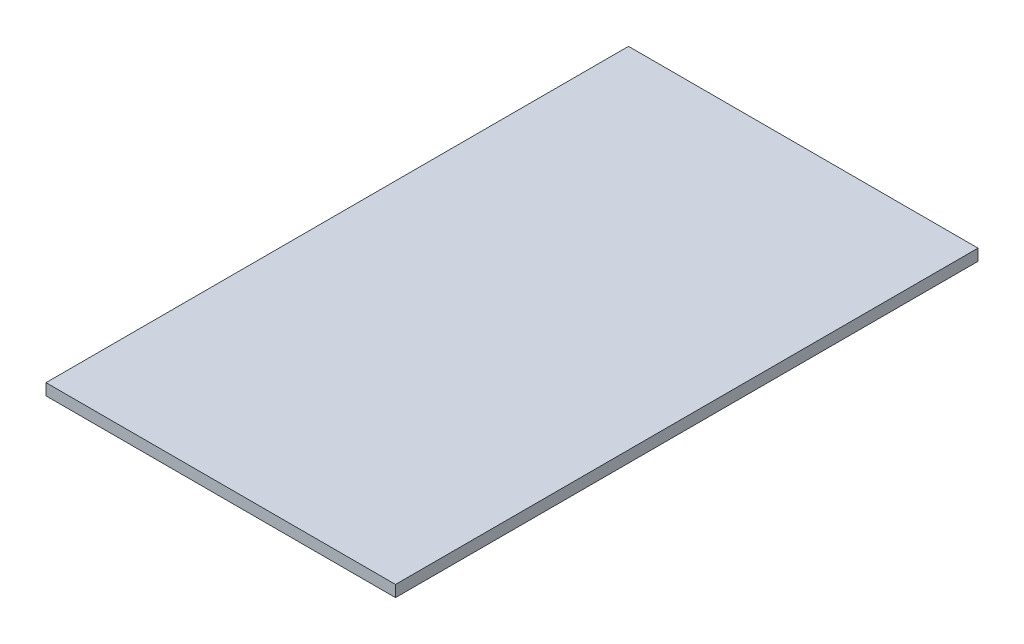
ISO-10303-21;
HEADER;
FILE_DESCRIPTION(('STEP AP214'),'2;1');
FILE_NAME('part.step','',(''),(''),'','','');
FILE_SCHEMA(('AUTOMOTIVE_DESIGN { 1 0 10303 214 1 1 1 1 }'));
ENDSEC;
DATA;
#1=APPLICATION_CONTEXT('core data for automotive mechanical design processes');
#2=APPLICATION_PROTOCOL_DEFINITION('international standard','automotive_design',2000,#1);
#3=PRODUCT_CONTEXT('',#1,'mechanical');
#4=PRODUCT('Part','Part','',(#3));
#5=PRODUCT_RELATED_PRODUCT_CATEGORY('part','',(#4));
#6=PRODUCT_DEFINITION_FORMATION('','',#4);
#7=PRODUCT_DEFINITION_CONTEXT('part definition',#1,'design');
#8=PRODUCT_DEFINITION('design','',#6,#7);
#9=PRODUCT_DEFINITION_SHAPE('','',#8);
#10=(LENGTH_UNIT() NAMED_UNIT(*) SI_UNIT(.MILLI.,.METRE.));
#11=(NAMED_UNIT(*) PLANE_ANGLE_UNIT() SI_UNIT($,.RADIAN.));
#12=(NAMED_UNIT(*) SI_UNIT($,.STERADIAN.) SOLID_ANGLE_UNIT());
#13=UNCERTAINTY_MEASURE_WITH_UNIT(LENGTH_MEASURE(1.E-05),#10,'distance_accuracy_value','');
#14=(GEOMETRIC_REPRESENTATION_CONTEXT(3) GLOBAL_UNCERTAINTY_ASSIGNED_CONTEXT((#13)) GLOBAL_UNIT_ASSIGNED_CONTEXT((#10,
#11,#12)) REPRESENTATION_CONTEXT('',''));
#15=CARTESIAN_POINT('',(0.,0.,0.));
#16=DIRECTION('',(0.,0.,1.));
#17=DIRECTION('',(1.,0.,0.));
#18=AXIS2_PLACEMENT_3D('',#15,#16,#17);
#19=CARTESIAN_POINT('',(-15.24,1.,25.4));
#20=DIRECTION('',(1.,0.,0.));
#21=DIRECTION('',(0.,0.,-1.));
#22=AXIS2_PLACEMENT_3D('',#19,#20,#21);
#23=PLANE('',#22);
#24=DIRECTION('',(0.,0.,1.));
#25=VECTOR('',#24,1.);
#26=CARTESIAN_POINT('',(-15.24,0.,25.4));
#27=LINE('',#26,#25);
#28=CARTESIAN_POINT('',(-15.24,0.,-25.4));
#29=VERTEX_POINT('',#28);
#30=CARTESIAN_POINT('',(-15.24,0.,25.4));
#31=VERTEX_POINT('',#30);
#32=EDGE_CURVE('E95',#29,#31,#27,.T.);
#33=ORIENTED_EDGE('',*,*,#32,.T.);
#34=DIRECTION('',(0.,-1.,0.));
#35=VECTOR('',#34,1.);
#36=CARTESIAN_POINT('',(-15.24,1.,25.4));
#37=LINE('',#36,#35);
#38=CARTESIAN_POINT('',(-15.24,1.,25.4));
#39=VERTEX_POINT('',#38);
#40=EDGE_CURVE('E11',#39,#31,#37,.T.);
#41=ORIENTED_EDGE('',*,*,#40,.F.);
#42=DIRECTION('',(0.,0.,1.));
#43=VECTOR('',#42,1.);
#44=CARTESIAN_POINT('',(-15.24,1.,25.4));
#45=LINE('',#44,#43);
#46=CARTESIAN_POINT('',(-15.24,1.,-25.4));
#47=VERTEX_POINT('',#46);
#48=EDGE_CURVE('E83',#47,#39,#45,.T.);
#49=ORIENTED_EDGE('',*,*,#48,.F.);
#50=DIRECTION('',(0.,-1.,0.));
#51=VECTOR('',#50,1.);
#52=CARTESIAN_POINT('',(-15.24,1.,-25.4));
#53=LINE('',#52,#51);
#54=EDGE_CURVE('E91',#47,#29,#53,.T.);
#55=ORIENTED_EDGE('',*,*,#54,.T.);
#56=EDGE_LOOP('',(#33,#41,#49,#55));
#57=FACE_BOUND('',#56,.T.);
#58=ADVANCED_FACE('F32',(#57),#23,.F.);
#59=CARTESIAN_POINT('',(15.24,1.,25.4));
#60=DIRECTION('',(0.,0.,-1.));
#61=DIRECTION('',(-1.,0.,0.));
#62=AXIS2_PLACEMENT_3D('',#59,#60,#61);
#63=PLANE('',#62);
#64=DIRECTION('',(1.,0.,0.));
#65=VECTOR('',#64,1.);
#66=CARTESIAN_POINT('',(15.24,0.,25.4));
#67=LINE('',#66,#65);
#68=CARTESIAN_POINT('',(15.24,0.,25.4));
#69=VERTEX_POINT('',#68);
#70=EDGE_CURVE('E87',#31,#69,#67,.T.);
#71=ORIENTED_EDGE('',*,*,#70,.T.);
#72=DIRECTION('',(0.,-1.,0.));
#73=VECTOR('',#72,1.);
#74=CARTESIAN_POINT('',(15.24,1.,25.4));
#75=LINE('',#74,#73);
#76=CARTESIAN_POINT('',(15.24,1.,25.4));
#77=VERTEX_POINT('',#76);
#78=EDGE_CURVE('E40',#77,#69,#75,.T.);
#79=ORIENTED_EDGE('',*,*,#78,.F.);
#80=DIRECTION('',(1.,0.,0.));
#81=VECTOR('',#80,1.);
#82=CARTESIAN_POINT('',(15.24,1.,25.4));
#83=LINE('',#82,#81);
#84=EDGE_CURVE('E78',#39,#77,#83,.T.);
#85=ORIENTED_EDGE('',*,*,#84,.F.);
#86=ORIENTED_EDGE('',*,*,#40,.T.);
#87=EDGE_LOOP('',(#71,#79,#85,#86));
#88=FACE_BOUND('',#87,.T.);
#89=ADVANCED_FACE('F86',(#88),#63,.F.);
#90=CARTESIAN_POINT('',(15.24,1.,25.4));
#91=DIRECTION('',(-1.,0.,0.));
#92=DIRECTION('',(0.,0.,1.));
#93=AXIS2_PLACEMENT_3D('',#90,#91,#92);
#94=PLANE('',#93);
#95=DIRECTION('',(0.,0.,-1.));
#96=VECTOR('',#95,1.);
#97=CARTESIAN_POINT('',(15.24,0.,25.4));
#98=LINE('',#97,#96);
#99=CARTESIAN_POINT('',(15.24,0.,-25.4));
#100=VERTEX_POINT('',#99);
#101=EDGE_CURVE('E65',#69,#100,#98,.T.);
#102=ORIENTED_EDGE('',*,*,#101,.T.);
#103=DIRECTION('',(0.,-1.,0.));
#104=VECTOR('',#103,1.);
#105=CARTESIAN_POINT('',(15.24,1.,-25.4));
#106=LINE('',#105,#104);
#107=CARTESIAN_POINT('',(15.24,1.,-25.4));
#108=VERTEX_POINT('',#107);
#109=EDGE_CURVE('E88',#108,#100,#106,.T.);
#110=ORIENTED_EDGE('',*,*,#109,.F.);
#111=DIRECTION('',(0.,0.,-1.));
#112=VECTOR('',#111,1.);
#113=CARTESIAN_POINT('',(15.24,1.,25.4));
#114=LINE('',#113,#112);
#115=EDGE_CURVE('E81',#77,#108,#114,.T.);
#116=ORIENTED_EDGE('',*,*,#115,.F.);
#117=ORIENTED_EDGE('',*,*,#78,.T.);
#118=EDGE_LOOP('',(#102,#110,#116,#117));
#119=FACE_BOUND('',#118,.T.);
#120=ADVANCED_FACE('F89',(#119),#94,.F.);
#121=CARTESIAN_POINT('',(15.24,1.,-25.4));
#122=DIRECTION('',(0.,0.,1.));
#123=DIRECTION('',(1.,0.,0.));
#124=AXIS2_PLACEMENT_3D('',#121,#122,#123);
#125=PLANE('',#124);
#126=DIRECTION('',(-1.,0.,0.));
#127=VECTOR('',#126,1.);
#128=CARTESIAN_POINT('',(15.24,0.,-25.4));
#129=LINE('',#128,#127);
#130=EDGE_CURVE('E71',#100,#29,#129,.T.);
#131=ORIENTED_EDGE('',*,*,#130,.T.);
#132=ORIENTED_EDGE('',*,*,#54,.F.);
#133=DIRECTION('',(-1.,0.,0.));
#134=VECTOR('',#133,1.);
#135=CARTESIAN_POINT('',(15.24,1.,-25.4));
#136=LINE('',#135,#134);
#137=EDGE_CURVE('E48',#108,#47,#136,.T.);
#138=ORIENTED_EDGE('',*,*,#137,.F.);
#139=ORIENTED_EDGE('',*,*,#109,.T.);
#140=EDGE_LOOP('',(#131,#132,#138,#139));
#141=FACE_BOUND('',#140,.T.);
#142=ADVANCED_FACE('F102',(#141),#125,.F.);
#143=CARTESIAN_POINT('',(0.,1.,0.));
#144=DIRECTION('',(0.,1.,0.));
#145=DIRECTION('',(0.,0.,1.));
#146=AXIS2_PLACEMENT_3D('',#143,#144,#145);
#147=PLANE('',#146);
#148=ORIENTED_EDGE('',*,*,#48,.T.);
#149=ORIENTED_EDGE('',*,*,#84,.T.);
#150=ORIENTED_EDGE('',*,*,#115,.T.);
#151=ORIENTED_EDGE('',*,*,#137,.T.);
#152=EDGE_LOOP('',(#148,#149,#150,#151));
#153=FACE_BOUND('',#152,.T.);
#154=ADVANCED_FACE('F79',(#153),#147,.T.);
#155=CARTESIAN_POINT('',(0.,0.,0.));
#156=DIRECTION('',(0.,1.,0.));
#157=DIRECTION('',(0.,0.,1.));
#158=AXIS2_PLACEMENT_3D('',#155,#156,#157);
#159=PLANE('',#158);
#160=ORIENTED_EDGE('',*,*,#32,.F.);
#161=ORIENTED_EDGE('',*,*,#130,.F.);
#162=ORIENTED_EDGE('',*,*,#101,.F.);
#163=ORIENTED_EDGE('',*,*,#70,.F.);
#164=EDGE_LOOP('',(#160,#161,#162,#163));
#165=FACE_BOUND('',#164,.T.);
#166=ADVANCED_FACE('F105',(#165),#159,.F.);
#167=CLOSED_SHELL('',(#58,#89,#120,#142,#154,#166));
#168=MANIFOLD_SOLID_BREP('B2',#167);
#169=ADVANCED_BREP_SHAPE_REPRESENTATION('',(#18,#168),#14);
#170=SHAPE_DEFINITION_REPRESENTATION(#9,#169);
ENDSEC;
END-ISO-10303-21;
